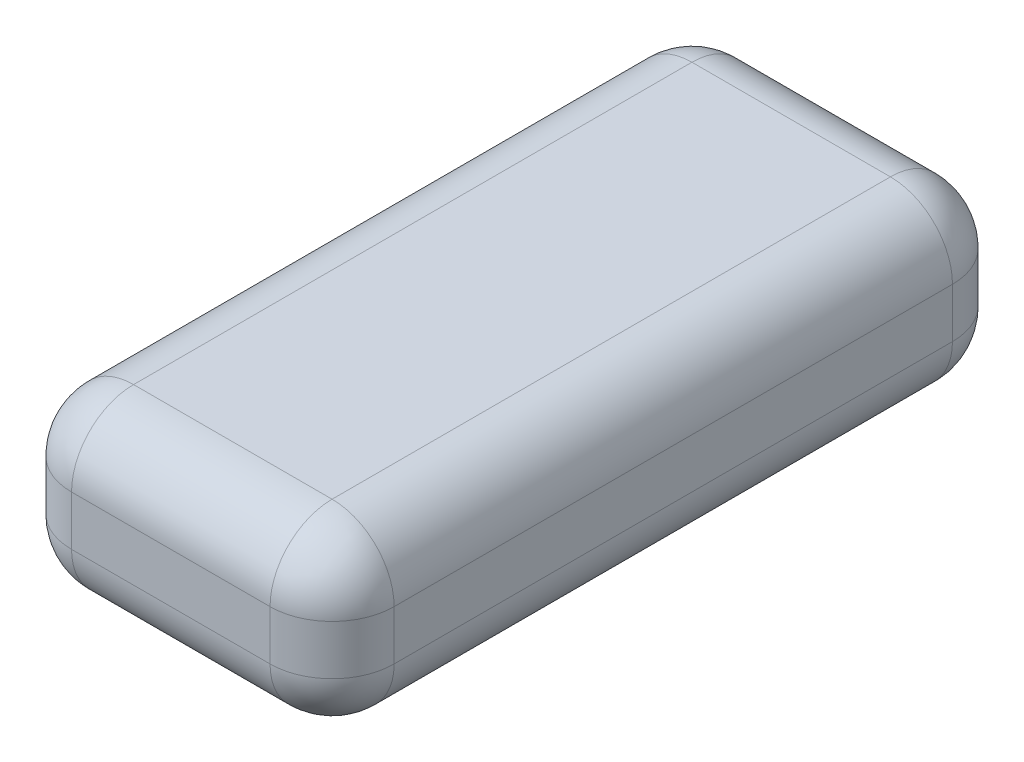
ISO-10303-21;
HEADER;
FILE_DESCRIPTION(('STEP AP214'),'2;1');
FILE_NAME('part.step','',(''),(''),'','','');
FILE_SCHEMA(('AUTOMOTIVE_DESIGN { 1 0 10303 214 1 1 1 1 }'));
ENDSEC;
DATA;
#1=APPLICATION_CONTEXT('core data for automotive mechanical design processes');
#2=APPLICATION_PROTOCOL_DEFINITION('international standard','automotive_design',2000,#1);
#3=PRODUCT_CONTEXT('',#1,'mechanical');
#4=PRODUCT('Part','Part','',(#3));
#5=PRODUCT_RELATED_PRODUCT_CATEGORY('part','',(#4));
#6=PRODUCT_DEFINITION_FORMATION('','',#4);
#7=PRODUCT_DEFINITION_CONTEXT('part definition',#1,'design');
#8=PRODUCT_DEFINITION('design','',#6,#7);
#9=PRODUCT_DEFINITION_SHAPE('','',#8);
#10=(LENGTH_UNIT() NAMED_UNIT(*) SI_UNIT(.MILLI.,.METRE.));
#11=(NAMED_UNIT(*) PLANE_ANGLE_UNIT() SI_UNIT($,.RADIAN.));
#12=(NAMED_UNIT(*) SI_UNIT($,.STERADIAN.) SOLID_ANGLE_UNIT());
#13=UNCERTAINTY_MEASURE_WITH_UNIT(LENGTH_MEASURE(1.E-05),#10,'distance_accuracy_value','');
#14=(GEOMETRIC_REPRESENTATION_CONTEXT(3) GLOBAL_UNCERTAINTY_ASSIGNED_CONTEXT((#13)) GLOBAL_UNIT_ASSIGNED_CONTEXT((#10,
#11,#12)) REPRESENTATION_CONTEXT('',''));
#15=CARTESIAN_POINT('',(0.,0.,0.));
#16=DIRECTION('',(0.,0.,1.));
#17=DIRECTION('',(1.,0.,0.));
#18=AXIS2_PLACEMENT_3D('',#15,#16,#17);
#19=CARTESIAN_POINT('',(-26.,-14.,110.));
#20=DIRECTION('',(1.,0.,0.));
#21=DIRECTION('',(0.,0.,-1.));
#22=AXIS2_PLACEMENT_3D('',#19,#20,#21);
#23=PLANE('',#22);
#24=DIRECTION('',(0.,-1.,0.));
#25=VECTOR('',#24,1.);
#26=CARTESIAN_POINT('',(-26.,14.,100.));
#27=LINE('',#26,#25);
#28=CARTESIAN_POINT('',(-26.,-4.,100.));
#29=VERTEX_POINT('',#28);
#30=CARTESIAN_POINT('',(-26.,4.,100.));
#31=VERTEX_POINT('',#30);
#32=EDGE_CURVE('E159',#29,#31,#27,.F.);
#33=ORIENTED_EDGE('',*,*,#32,.T.);
#34=DIRECTION('',(0.,0.,-1.));
#35=VECTOR('',#34,1.);
#36=CARTESIAN_POINT('',(-26.,4.,110.));
#37=LINE('',#36,#35);
#38=CARTESIAN_POINT('',(-26.,4.,9.99999999999999));
#39=VERTEX_POINT('',#38);
#40=EDGE_CURVE('E132',#31,#39,#37,.T.);
#41=ORIENTED_EDGE('',*,*,#40,.T.);
#42=DIRECTION('',(0.,-1.,0.));
#43=VECTOR('',#42,1.);
#44=CARTESIAN_POINT('',(-26.,-14.,9.99999999999999));
#45=LINE('',#44,#43);
#46=CARTESIAN_POINT('',(-26.,-4.,9.99999999999999));
#47=VERTEX_POINT('',#46);
#48=EDGE_CURVE('E150',#39,#47,#45,.T.);
#49=ORIENTED_EDGE('',*,*,#48,.T.);
#50=DIRECTION('',(0.,0.,-1.));
#51=VECTOR('',#50,1.);
#52=CARTESIAN_POINT('',(-26.,-4.,110.));
#53=LINE('',#52,#51);
#54=EDGE_CURVE('E156',#47,#29,#53,.F.);
#55=ORIENTED_EDGE('',*,*,#54,.T.);
#56=EDGE_LOOP('',(#33,#41,#49,#55));
#57=FACE_BOUND('',#56,.T.);
#58=ADVANCED_FACE('F39',(#57),#23,.F.);
#59=CARTESIAN_POINT('',(26.,-14.,110.));
#60=DIRECTION('',(0.,1.,0.));
#61=DIRECTION('',(-1.,0.,0.));
#62=AXIS2_PLACEMENT_3D('',#59,#60,#61);
#63=PLANE('',#62);
#64=DIRECTION('',(1.,0.,0.));
#65=VECTOR('',#64,1.);
#66=CARTESIAN_POINT('',(-26.,-14.,100.));
#67=LINE('',#66,#65);
#68=CARTESIAN_POINT('',(16.,-14.,100.));
#69=VERTEX_POINT('',#68);
#70=CARTESIAN_POINT('',(-16.,-14.,100.));
#71=VERTEX_POINT('',#70);
#72=EDGE_CURVE('E181',#69,#71,#67,.F.);
#73=ORIENTED_EDGE('',*,*,#72,.T.);
#74=DIRECTION('',(0.,0.,-1.));
#75=VECTOR('',#74,1.);
#76=CARTESIAN_POINT('',(-16.,-14.,110.));
#77=LINE('',#76,#75);
#78=CARTESIAN_POINT('',(-16.,-14.,9.99999999999999));
#79=VERTEX_POINT('',#78);
#80=EDGE_CURVE('E187',#71,#79,#77,.T.);
#81=ORIENTED_EDGE('',*,*,#80,.T.);
#82=DIRECTION('',(1.,0.,0.));
#83=VECTOR('',#82,1.);
#84=CARTESIAN_POINT('',(26.,-14.,9.99999999999999));
#85=LINE('',#84,#83);
#86=CARTESIAN_POINT('',(16.,-14.,9.99999999999999));
#87=VERTEX_POINT('',#86);
#88=EDGE_CURVE('E185',#79,#87,#85,.T.);
#89=ORIENTED_EDGE('',*,*,#88,.T.);
#90=DIRECTION('',(0.,0.,-1.));
#91=VECTOR('',#90,1.);
#92=CARTESIAN_POINT('',(16.,-14.,110.));
#93=LINE('',#92,#91);
#94=EDGE_CURVE('E183',#87,#69,#93,.F.);
#95=ORIENTED_EDGE('',*,*,#94,.T.);
#96=EDGE_LOOP('',(#73,#81,#89,#95));
#97=FACE_BOUND('',#96,.T.);
#98=ADVANCED_FACE('F282',(#97),#63,.F.);
#99=CARTESIAN_POINT('',(26.,-14.,110.));
#100=DIRECTION('',(-1.,0.,0.));
#101=DIRECTION('',(0.,0.,1.));
#102=AXIS2_PLACEMENT_3D('',#99,#100,#101);
#103=PLANE('',#102);
#104=DIRECTION('',(0.,0.,-1.));
#105=VECTOR('',#104,1.);
#106=CARTESIAN_POINT('',(26.,-4.,110.));
#107=LINE('',#106,#105);
#108=CARTESIAN_POINT('',(26.,-4.,100.));
#109=VERTEX_POINT('',#108);
#110=CARTESIAN_POINT('',(26.,-4.,9.99999999999999));
#111=VERTEX_POINT('',#110);
#112=EDGE_CURVE('E48',#109,#111,#107,.T.);
#113=ORIENTED_EDGE('',*,*,#112,.T.);
#114=DIRECTION('',(0.,1.,0.));
#115=VECTOR('',#114,1.);
#116=CARTESIAN_POINT('',(26.,-14.,9.99999999999999));
#117=LINE('',#116,#115);
#118=CARTESIAN_POINT('',(26.,4.,9.99999999999999));
#119=VERTEX_POINT('',#118);
#120=EDGE_CURVE('E11',#111,#119,#117,.T.);
#121=ORIENTED_EDGE('',*,*,#120,.T.);
#122=DIRECTION('',(0.,0.,-1.));
#123=VECTOR('',#122,1.);
#124=CARTESIAN_POINT('',(26.,4.00000000000001,110.));
#125=LINE('',#124,#123);
#126=CARTESIAN_POINT('',(26.,4.,100.));
#127=VERTEX_POINT('',#126);
#128=EDGE_CURVE('E199',#119,#127,#125,.F.);
#129=ORIENTED_EDGE('',*,*,#128,.T.);
#130=DIRECTION('',(0.,1.,0.));
#131=VECTOR('',#130,1.);
#132=CARTESIAN_POINT('',(26.,-14.,100.));
#133=LINE('',#132,#131);
#134=EDGE_CURVE('E59',#127,#109,#133,.F.);
#135=ORIENTED_EDGE('',*,*,#134,.T.);
#136=EDGE_LOOP('',(#113,#121,#129,#135));
#137=FACE_BOUND('',#136,.T.);
#138=ADVANCED_FACE('F301',(#137),#103,.F.);
#139=CARTESIAN_POINT('',(26.,14.,110.));
#140=DIRECTION('',(0.,-1.,0.));
#141=DIRECTION('',(1.,0.,0.));
#142=AXIS2_PLACEMENT_3D('',#139,#140,#141);
#143=PLANE('',#142);
#144=DIRECTION('',(-1.,0.,0.));
#145=VECTOR('',#144,1.);
#146=CARTESIAN_POINT('',(26.,14.,9.99999999999999));
#147=LINE('',#146,#145);
#148=CARTESIAN_POINT('',(16.,14.,9.99999999999999));
#149=VERTEX_POINT('',#148);
#150=CARTESIAN_POINT('',(-16.,14.,9.99999999999999));
#151=VERTEX_POINT('',#150);
#152=EDGE_CURVE('E169',#149,#151,#147,.T.);
#153=ORIENTED_EDGE('',*,*,#152,.T.);
#154=DIRECTION('',(0.,0.,-1.));
#155=VECTOR('',#154,1.);
#156=CARTESIAN_POINT('',(-16.,14.,110.));
#157=LINE('',#156,#155);
#158=CARTESIAN_POINT('',(-16.,14.,100.));
#159=VERTEX_POINT('',#158);
#160=EDGE_CURVE('E134',#151,#159,#157,.F.);
#161=ORIENTED_EDGE('',*,*,#160,.T.);
#162=DIRECTION('',(-1.,0.,0.));
#163=VECTOR('',#162,1.);
#164=CARTESIAN_POINT('',(26.,14.,100.));
#165=LINE('',#164,#163);
#166=CARTESIAN_POINT('',(16.,14.,100.));
#167=VERTEX_POINT('',#166);
#168=EDGE_CURVE('E161',#159,#167,#165,.F.);
#169=ORIENTED_EDGE('',*,*,#168,.T.);
#170=DIRECTION('',(0.,0.,-1.));
#171=VECTOR('',#170,1.);
#172=CARTESIAN_POINT('',(16.,14.,110.));
#173=LINE('',#172,#171);
#174=EDGE_CURVE('E163',#167,#149,#173,.T.);
#175=ORIENTED_EDGE('',*,*,#174,.T.);
#176=EDGE_LOOP('',(#153,#161,#169,#175));
#177=FACE_BOUND('',#176,.T.);
#178=ADVANCED_FACE('F360',(#177),#143,.F.);
#179=CARTESIAN_POINT('',(0.,0.,110.));
#180=DIRECTION('',(0.,0.,1.));
#181=DIRECTION('',(1.,0.,0.));
#182=AXIS2_PLACEMENT_3D('',#179,#180,#181);
#183=PLANE('',#182);
#184=DIRECTION('',(-1.,0.,0.));
#185=VECTOR('',#184,1.);
#186=CARTESIAN_POINT('',(-26.,4.,110.));
#187=LINE('',#186,#185);
#188=CARTESIAN_POINT('',(16.,4.,110.));
#189=VERTEX_POINT('',#188);
#190=CARTESIAN_POINT('',(-16.,4.,110.));
#191=VERTEX_POINT('',#190);
#192=EDGE_CURVE('E172',#189,#191,#187,.T.);
#193=ORIENTED_EDGE('',*,*,#192,.T.);
#194=DIRECTION('',(0.,-1.,0.));
#195=VECTOR('',#194,1.);
#196=CARTESIAN_POINT('',(-16.,-14.,110.));
#197=LINE('',#196,#195);
#198=CARTESIAN_POINT('',(-16.,-4.,110.));
#199=VERTEX_POINT('',#198);
#200=EDGE_CURVE('E178',#191,#199,#197,.T.);
#201=ORIENTED_EDGE('',*,*,#200,.T.);
#202=DIRECTION('',(1.,0.,0.));
#203=VECTOR('',#202,1.);
#204=CARTESIAN_POINT('',(26.,-4.,110.));
#205=LINE('',#204,#203);
#206=CARTESIAN_POINT('',(16.,-4.,110.));
#207=VERTEX_POINT('',#206);
#208=EDGE_CURVE('E176',#199,#207,#205,.T.);
#209=ORIENTED_EDGE('',*,*,#208,.T.);
#210=DIRECTION('',(0.,1.,0.));
#211=VECTOR('',#210,1.);
#212=CARTESIAN_POINT('',(16.,14.,110.));
#213=LINE('',#212,#211);
#214=EDGE_CURVE('E174',#207,#189,#213,.T.);
#215=ORIENTED_EDGE('',*,*,#214,.T.);
#216=EDGE_LOOP('',(#193,#201,#209,#215));
#217=FACE_BOUND('',#216,.T.);
#218=ADVANCED_FACE('F273',(#217),#183,.T.);
#219=CARTESIAN_POINT('',(0.,0.,0.));
#220=DIRECTION('',(0.,0.,1.));
#221=DIRECTION('',(1.,0.,0.));
#222=AXIS2_PLACEMENT_3D('',#219,#220,#221);
#223=PLANE('',#222);
#224=DIRECTION('',(1.,0.,0.));
#225=VECTOR('',#224,1.);
#226=CARTESIAN_POINT('',(0.,-4.,0.));
#227=LINE('',#226,#225);
#228=CARTESIAN_POINT('',(16.,-4.,0.));
#229=VERTEX_POINT('',#228);
#230=CARTESIAN_POINT('',(-16.,-4.,0.));
#231=VERTEX_POINT('',#230);
#232=EDGE_CURVE('E194',#229,#231,#227,.F.);
#233=ORIENTED_EDGE('',*,*,#232,.T.);
#234=DIRECTION('',(0.,-1.,0.));
#235=VECTOR('',#234,1.);
#236=CARTESIAN_POINT('',(-16.,0.,0.));
#237=LINE('',#236,#235);
#238=CARTESIAN_POINT('',(-16.,4.,0.));
#239=VERTEX_POINT('',#238);
#240=EDGE_CURVE('E196',#231,#239,#237,.F.);
#241=ORIENTED_EDGE('',*,*,#240,.T.);
#242=DIRECTION('',(-1.,0.,0.));
#243=VECTOR('',#242,1.);
#244=CARTESIAN_POINT('',(0.,4.,0.));
#245=LINE('',#244,#243);
#246=CARTESIAN_POINT('',(16.,4.,0.));
#247=VERTEX_POINT('',#246);
#248=EDGE_CURVE('E192',#239,#247,#245,.F.);
#249=ORIENTED_EDGE('',*,*,#248,.T.);
#250=DIRECTION('',(0.,1.,0.));
#251=VECTOR('',#250,1.);
#252=CARTESIAN_POINT('',(16.,0.,0.));
#253=LINE('',#252,#251);
#254=EDGE_CURVE('E190',#247,#229,#253,.F.);
#255=ORIENTED_EDGE('',*,*,#254,.T.);
#256=EDGE_LOOP('',(#233,#241,#249,#255));
#257=FACE_BOUND('',#256,.T.);
#258=ADVANCED_FACE('F367',(#257),#223,.F.);
#259=CARTESIAN_POINT('',(16.,-4.,110.));
#260=DIRECTION('',(0.,0.,-1.));
#261=DIRECTION('',(-1.,0.,0.));
#262=AXIS2_PLACEMENT_3D('',#259,#260,#261);
#263=CYLINDRICAL_SURFACE('',#262,10.);
#264=CARTESIAN_POINT('',(16.,-4.,100.));
#265=DIRECTION('',(0.,0.,1.));
#266=DIRECTION('',(1.,0.,0.));
#267=AXIS2_PLACEMENT_3D('',#264,#265,#266);
#268=CIRCLE('',#267,10.);
#269=EDGE_CURVE('E43',#69,#109,#268,.T.);
#270=ORIENTED_EDGE('',*,*,#269,.F.);
#271=ORIENTED_EDGE('',*,*,#94,.F.);
#272=CARTESIAN_POINT('',(16.,-4.,9.99999999999999));
#273=DIRECTION('',(0.,0.,-1.));
#274=DIRECTION('',(-1.,0.,0.));
#275=AXIS2_PLACEMENT_3D('',#272,#273,#274);
#276=CIRCLE('',#275,10.);
#277=EDGE_CURVE('E252',#111,#87,#276,.T.);
#278=ORIENTED_EDGE('',*,*,#277,.F.);
#279=ORIENTED_EDGE('',*,*,#112,.F.);
#280=EDGE_LOOP('',(#270,#271,#278,#279));
#281=FACE_BOUND('',#280,.T.);
#282=ADVANCED_FACE('F41',(#281),#263,.T.);
#283=CARTESIAN_POINT('',(16.,-4.,100.));
#284=DIRECTION('',(1.,0.,0.));
#285=DIRECTION('',(0.,0.,-1.));
#286=AXIS2_PLACEMENT_3D('',#283,#284,#285);
#287=SPHERICAL_SURFACE('',#286,10.);
#288=CARTESIAN_POINT('',(16.,-4.,100.));
#289=DIRECTION('',(1.,0.,0.));
#290=DIRECTION('',(0.,0.,-1.));
#291=AXIS2_PLACEMENT_3D('',#288,#289,#290);
#292=CIRCLE('',#291,10.);
#293=EDGE_CURVE('E247',#69,#207,#292,.F.);
#294=ORIENTED_EDGE('',*,*,#293,.F.);
#295=ORIENTED_EDGE('',*,*,#269,.T.);
#296=CARTESIAN_POINT('',(16.,-4.,100.));
#297=DIRECTION('',(0.,-1.,0.));
#298=DIRECTION('',(0.,0.,-1.));
#299=AXIS2_PLACEMENT_3D('',#296,#297,#298);
#300=CIRCLE('',#299,10.);
#301=EDGE_CURVE('E250',#207,#109,#300,.F.);
#302=ORIENTED_EDGE('',*,*,#301,.F.);
#303=EDGE_LOOP('',(#294,#295,#302));
#304=FACE_BOUND('',#303,.T.);
#305=ADVANCED_FACE('F262',(#304),#287,.T.);
#306=CARTESIAN_POINT('',(16.,-4.,10.));
#307=DIRECTION('',(0.,-1.,0.));
#308=DIRECTION('',(0.,0.,-1.));
#309=AXIS2_PLACEMENT_3D('',#306,#307,#308);
#310=SPHERICAL_SURFACE('',#309,10.);
#311=CARTESIAN_POINT('',(16.,-4.,10.));
#312=DIRECTION('',(0.,-1.,0.));
#313=DIRECTION('',(0.,0.,-1.));
#314=AXIS2_PLACEMENT_3D('',#311,#312,#313);
#315=CIRCLE('',#314,10.);
#316=EDGE_CURVE('E241',#111,#229,#315,.F.);
#317=ORIENTED_EDGE('',*,*,#316,.F.);
#318=ORIENTED_EDGE('',*,*,#277,.T.);
#319=CARTESIAN_POINT('',(16.,-4.,9.99999999999999));
#320=DIRECTION('',(1.,0.,0.));
#321=DIRECTION('',(0.,0.,-1.));
#322=AXIS2_PLACEMENT_3D('',#319,#320,#321);
#323=CIRCLE('',#322,10.);
#324=EDGE_CURVE('E244',#229,#87,#323,.F.);
#325=ORIENTED_EDGE('',*,*,#324,.F.);
#326=EDGE_LOOP('',(#317,#318,#325));
#327=FACE_BOUND('',#326,.T.);
#328=ADVANCED_FACE('F295',(#327),#310,.T.);
#329=CARTESIAN_POINT('',(16.,0.,100.));
#330=DIRECTION('',(0.,-1.,0.));
#331=DIRECTION('',(0.,0.,-1.));
#332=AXIS2_PLACEMENT_3D('',#329,#330,#331);
#333=CYLINDRICAL_SURFACE('',#332,10.);
#334=ORIENTED_EDGE('',*,*,#301,.T.);
#335=ORIENTED_EDGE('',*,*,#134,.F.);
#336=CARTESIAN_POINT('',(16.,4.,100.));
#337=DIRECTION('',(0.,1.,0.));
#338=DIRECTION('',(0.,0.,1.));
#339=AXIS2_PLACEMENT_3D('',#336,#337,#338);
#340=CIRCLE('',#339,10.);
#341=EDGE_CURVE('E235',#189,#127,#340,.T.);
#342=ORIENTED_EDGE('',*,*,#341,.F.);
#343=ORIENTED_EDGE('',*,*,#214,.F.);
#344=EDGE_LOOP('',(#334,#335,#342,#343));
#345=FACE_BOUND('',#344,.T.);
#346=ADVANCED_FACE('F268',(#345),#333,.T.);
#347=CARTESIAN_POINT('',(0.,-4.,100.));
#348=DIRECTION('',(-1.,0.,0.));
#349=DIRECTION('',(0.,-1.,0.));
#350=AXIS2_PLACEMENT_3D('',#347,#348,#349);
#351=CYLINDRICAL_SURFACE('',#350,10.);
#352=ORIENTED_EDGE('',*,*,#293,.T.);
#353=ORIENTED_EDGE('',*,*,#208,.F.);
#354=CARTESIAN_POINT('',(-16.,-4.,100.));
#355=DIRECTION('',(-1.,0.,0.));
#356=DIRECTION('',(0.,0.,1.));
#357=AXIS2_PLACEMENT_3D('',#354,#355,#356);
#358=CIRCLE('',#357,10.);
#359=EDGE_CURVE('E232',#71,#199,#358,.T.);
#360=ORIENTED_EDGE('',*,*,#359,.F.);
#361=ORIENTED_EDGE('',*,*,#72,.F.);
#362=EDGE_LOOP('',(#352,#353,#360,#361));
#363=FACE_BOUND('',#362,.T.);
#364=ADVANCED_FACE('F279',(#363),#351,.T.);
#365=CARTESIAN_POINT('',(-16.,-4.,110.));
#366=DIRECTION('',(0.,0.,-1.));
#367=DIRECTION('',(-1.,0.,0.));
#368=AXIS2_PLACEMENT_3D('',#365,#366,#367);
#369=CYLINDRICAL_SURFACE('',#368,10.);
#370=CARTESIAN_POINT('',(-16.,-4.,9.99999999999999));
#371=DIRECTION('',(0.,0.,-1.));
#372=DIRECTION('',(-1.,0.,0.));
#373=AXIS2_PLACEMENT_3D('',#370,#371,#372);
#374=CIRCLE('',#373,10.);
#375=EDGE_CURVE('E226',#79,#47,#374,.T.);
#376=ORIENTED_EDGE('',*,*,#375,.F.);
#377=ORIENTED_EDGE('',*,*,#80,.F.);
#378=CARTESIAN_POINT('',(-16.,-4.,100.));
#379=DIRECTION('',(0.,0.,1.));
#380=DIRECTION('',(1.,0.,0.));
#381=AXIS2_PLACEMENT_3D('',#378,#379,#380);
#382=CIRCLE('',#381,10.);
#383=EDGE_CURVE('E229',#29,#71,#382,.T.);
#384=ORIENTED_EDGE('',*,*,#383,.F.);
#385=ORIENTED_EDGE('',*,*,#54,.F.);
#386=EDGE_LOOP('',(#376,#377,#384,#385));
#387=FACE_BOUND('',#386,.T.);
#388=ADVANCED_FACE('F286',(#387),#369,.T.);
#389=CARTESIAN_POINT('',(26.,-4.,9.99999999999999));
#390=DIRECTION('',(1.,0.,0.));
#391=DIRECTION('',(0.,1.,0.));
#392=AXIS2_PLACEMENT_3D('',#389,#390,#391);
#393=CYLINDRICAL_SURFACE('',#392,10.);
#394=ORIENTED_EDGE('',*,*,#324,.T.);
#395=ORIENTED_EDGE('',*,*,#88,.F.);
#396=CARTESIAN_POINT('',(-16.,-4.,10.));
#397=DIRECTION('',(-1.,0.,0.));
#398=DIRECTION('',(0.,0.,1.));
#399=AXIS2_PLACEMENT_3D('',#396,#397,#398);
#400=CIRCLE('',#399,10.);
#401=EDGE_CURVE('E224',#231,#79,#400,.T.);
#402=ORIENTED_EDGE('',*,*,#401,.F.);
#403=ORIENTED_EDGE('',*,*,#232,.F.);
#404=EDGE_LOOP('',(#394,#395,#402,#403));
#405=FACE_BOUND('',#404,.T.);
#406=ADVANCED_FACE('F292',(#405),#393,.T.);
#407=CARTESIAN_POINT('',(16.,-14.,9.99999999999999));
#408=DIRECTION('',(0.,1.,0.));
#409=DIRECTION('',(0.,0.,1.));
#410=AXIS2_PLACEMENT_3D('',#407,#408,#409);
#411=CYLINDRICAL_SURFACE('',#410,10.);
#412=ORIENTED_EDGE('',*,*,#316,.T.);
#413=ORIENTED_EDGE('',*,*,#254,.F.);
#414=CARTESIAN_POINT('',(16.,4.,9.99999999999999));
#415=DIRECTION('',(0.,1.,0.));
#416=DIRECTION('',(0.,0.,1.));
#417=AXIS2_PLACEMENT_3D('',#414,#415,#416);
#418=CIRCLE('',#417,10.);
#419=EDGE_CURVE('E221',#119,#247,#418,.T.);
#420=ORIENTED_EDGE('',*,*,#419,.F.);
#421=ORIENTED_EDGE('',*,*,#120,.F.);
#422=EDGE_LOOP('',(#412,#413,#420,#421));
#423=FACE_BOUND('',#422,.T.);
#424=ADVANCED_FACE('F299',(#423),#411,.T.);
#425=CARTESIAN_POINT('',(16.,4.,110.));
#426=DIRECTION('',(0.,0.,-1.));
#427=DIRECTION('',(-1.,0.,0.));
#428=AXIS2_PLACEMENT_3D('',#425,#426,#427);
#429=CYLINDRICAL_SURFACE('',#428,10.);
#430=CARTESIAN_POINT('',(16.,4.,100.));
#431=DIRECTION('',(0.,0.,1.));
#432=DIRECTION('',(1.,0.,0.));
#433=AXIS2_PLACEMENT_3D('',#430,#431,#432);
#434=CIRCLE('',#433,10.);
#435=EDGE_CURVE('E238',#127,#167,#434,.T.);
#436=ORIENTED_EDGE('',*,*,#435,.F.);
#437=ORIENTED_EDGE('',*,*,#128,.F.);
#438=CARTESIAN_POINT('',(16.,4.,9.99999999999999));
#439=DIRECTION('',(0.,0.,-1.));
#440=DIRECTION('',(-1.,0.,0.));
#441=AXIS2_PLACEMENT_3D('',#438,#439,#440);
#442=CIRCLE('',#441,10.);
#443=EDGE_CURVE('E219',#149,#119,#442,.T.);
#444=ORIENTED_EDGE('',*,*,#443,.F.);
#445=ORIENTED_EDGE('',*,*,#174,.F.);
#446=EDGE_LOOP('',(#436,#437,#444,#445));
#447=FACE_BOUND('',#446,.T.);
#448=ADVANCED_FACE('F304',(#447),#429,.T.);
#449=CARTESIAN_POINT('',(16.,4.,100.));
#450=DIRECTION('',(1.,0.,0.));
#451=DIRECTION('',(0.,0.,-1.));
#452=AXIS2_PLACEMENT_3D('',#449,#450,#451);
#453=SPHERICAL_SURFACE('',#452,10.);
#454=ORIENTED_EDGE('',*,*,#341,.T.);
#455=ORIENTED_EDGE('',*,*,#435,.T.);
#456=CARTESIAN_POINT('',(16.,4.,100.));
#457=DIRECTION('',(1.,0.,0.));
#458=DIRECTION('',(0.,0.,-1.));
#459=AXIS2_PLACEMENT_3D('',#456,#457,#458);
#460=CIRCLE('',#459,10.);
#461=EDGE_CURVE('E216',#189,#167,#460,.F.);
#462=ORIENTED_EDGE('',*,*,#461,.F.);
#463=EDGE_LOOP('',(#454,#455,#462));
#464=FACE_BOUND('',#463,.T.);
#465=ADVANCED_FACE('F308',(#464),#453,.T.);
#466=CARTESIAN_POINT('',(-16.,-4.,100.));
#467=DIRECTION('',(0.,-1.,0.));
#468=DIRECTION('',(0.,0.,-1.));
#469=AXIS2_PLACEMENT_3D('',#466,#467,#468);
#470=SPHERICAL_SURFACE('',#469,10.);
#471=ORIENTED_EDGE('',*,*,#383,.T.);
#472=ORIENTED_EDGE('',*,*,#359,.T.);
#473=CARTESIAN_POINT('',(-16.,-4.,100.));
#474=DIRECTION('',(0.,-1.,0.));
#475=DIRECTION('',(0.,0.,-1.));
#476=AXIS2_PLACEMENT_3D('',#473,#474,#475);
#477=CIRCLE('',#476,10.);
#478=EDGE_CURVE('E214',#29,#199,#477,.F.);
#479=ORIENTED_EDGE('',*,*,#478,.F.);
#480=EDGE_LOOP('',(#471,#472,#479));
#481=FACE_BOUND('',#480,.T.);
#482=ADVANCED_FACE('F319',(#481),#470,.T.);
#483=CARTESIAN_POINT('',(-16.,-4.,10.));
#484=DIRECTION('',(0.,-1.,0.));
#485=DIRECTION('',(0.,0.,-1.));
#486=AXIS2_PLACEMENT_3D('',#483,#484,#485);
#487=SPHERICAL_SURFACE('',#486,10.);
#488=ORIENTED_EDGE('',*,*,#401,.T.);
#489=ORIENTED_EDGE('',*,*,#375,.T.);
#490=CARTESIAN_POINT('',(-16.,-4.,9.99999999999999));
#491=DIRECTION('',(0.,-1.,0.));
#492=DIRECTION('',(0.,0.,-1.));
#493=AXIS2_PLACEMENT_3D('',#490,#491,#492);
#494=CIRCLE('',#493,10.);
#495=EDGE_CURVE('E153',#231,#47,#494,.F.);
#496=ORIENTED_EDGE('',*,*,#495,.F.);
#497=EDGE_LOOP('',(#488,#489,#496));
#498=FACE_BOUND('',#497,.T.);
#499=ADVANCED_FACE('F321',(#498),#487,.T.);
#500=CARTESIAN_POINT('',(16.,4.,10.));
#501=DIRECTION('',(1.,0.,0.));
#502=DIRECTION('',(0.,0.,-1.));
#503=AXIS2_PLACEMENT_3D('',#500,#501,#502);
#504=SPHERICAL_SURFACE('',#503,10.);
#505=ORIENTED_EDGE('',*,*,#443,.T.);
#506=ORIENTED_EDGE('',*,*,#419,.T.);
#507=CARTESIAN_POINT('',(16.,4.,10.));
#508=DIRECTION('',(1.,0.,0.));
#509=DIRECTION('',(0.,0.,-1.));
#510=AXIS2_PLACEMENT_3D('',#507,#508,#509);
#511=CIRCLE('',#510,10.);
#512=EDGE_CURVE('E210',#149,#247,#511,.F.);
#513=ORIENTED_EDGE('',*,*,#512,.F.);
#514=EDGE_LOOP('',(#505,#506,#513));
#515=FACE_BOUND('',#514,.T.);
#516=ADVANCED_FACE('F327',(#515),#504,.T.);
#517=CARTESIAN_POINT('',(0.,4.,100.));
#518=DIRECTION('',(1.,0.,0.));
#519=DIRECTION('',(0.,1.,0.));
#520=AXIS2_PLACEMENT_3D('',#517,#518,#519);
#521=CYLINDRICAL_SURFACE('',#520,10.);
#522=ORIENTED_EDGE('',*,*,#461,.T.);
#523=ORIENTED_EDGE('',*,*,#168,.F.);
#524=CARTESIAN_POINT('',(-16.,4.,100.));
#525=DIRECTION('',(-1.,0.,0.));
#526=DIRECTION('',(0.,0.,1.));
#527=AXIS2_PLACEMENT_3D('',#524,#525,#526);
#528=CIRCLE('',#527,10.);
#529=EDGE_CURVE('E207',#191,#159,#528,.T.);
#530=ORIENTED_EDGE('',*,*,#529,.F.);
#531=ORIENTED_EDGE('',*,*,#192,.F.);
#532=EDGE_LOOP('',(#522,#523,#530,#531));
#533=FACE_BOUND('',#532,.T.);
#534=ADVANCED_FACE('F312',(#533),#521,.T.);
#535=CARTESIAN_POINT('',(-16.,0.,100.));
#536=DIRECTION('',(0.,1.,0.));
#537=DIRECTION('',(0.,0.,1.));
#538=AXIS2_PLACEMENT_3D('',#535,#536,#537);
#539=CYLINDRICAL_SURFACE('',#538,10.);
#540=ORIENTED_EDGE('',*,*,#478,.T.);
#541=ORIENTED_EDGE('',*,*,#200,.F.);
#542=CARTESIAN_POINT('',(-16.,4.,100.));
#543=DIRECTION('',(0.,1.,0.));
#544=DIRECTION('',(0.,0.,1.));
#545=AXIS2_PLACEMENT_3D('',#542,#543,#544);
#546=CIRCLE('',#545,10.);
#547=EDGE_CURVE('E147',#31,#191,#546,.T.);
#548=ORIENTED_EDGE('',*,*,#547,.F.);
#549=ORIENTED_EDGE('',*,*,#32,.F.);
#550=EDGE_LOOP('',(#540,#541,#548,#549));
#551=FACE_BOUND('',#550,.T.);
#552=ADVANCED_FACE('F317',(#551),#539,.T.);
#553=CARTESIAN_POINT('',(-16.,-14.,9.99999999999999));
#554=DIRECTION('',(0.,-1.,0.));
#555=DIRECTION('',(0.,0.,-1.));
#556=AXIS2_PLACEMENT_3D('',#553,#554,#555);
#557=CYLINDRICAL_SURFACE('',#556,10.);
#558=ORIENTED_EDGE('',*,*,#495,.T.);
#559=ORIENTED_EDGE('',*,*,#48,.F.);
#560=CARTESIAN_POINT('',(-16.,4.,10.));
#561=DIRECTION('',(0.,1.,0.));
#562=DIRECTION('',(-1.,0.,0.));
#563=AXIS2_PLACEMENT_3D('',#560,#561,#562);
#564=CIRCLE('',#563,10.);
#565=EDGE_CURVE('E139',#239,#39,#564,.T.);
#566=ORIENTED_EDGE('',*,*,#565,.F.);
#567=ORIENTED_EDGE('',*,*,#240,.F.);
#568=EDGE_LOOP('',(#558,#559,#566,#567));
#569=FACE_BOUND('',#568,.T.);
#570=ADVANCED_FACE('F151',(#569),#557,.T.);
#571=CARTESIAN_POINT('',(26.,4.00000000000001,9.99999999999999));
#572=DIRECTION('',(-1.,0.,0.));
#573=DIRECTION('',(0.,-1.,0.));
#574=AXIS2_PLACEMENT_3D('',#571,#572,#573);
#575=CYLINDRICAL_SURFACE('',#574,10.);
#576=ORIENTED_EDGE('',*,*,#512,.T.);
#577=ORIENTED_EDGE('',*,*,#248,.F.);
#578=CARTESIAN_POINT('',(-16.,4.,9.99999999999999));
#579=DIRECTION('',(-1.,0.,0.));
#580=DIRECTION('',(0.,0.,1.));
#581=AXIS2_PLACEMENT_3D('',#578,#579,#580);
#582=CIRCLE('',#581,10.);
#583=EDGE_CURVE('E143',#151,#239,#582,.T.);
#584=ORIENTED_EDGE('',*,*,#583,.F.);
#585=ORIENTED_EDGE('',*,*,#152,.F.);
#586=EDGE_LOOP('',(#576,#577,#584,#585));
#587=FACE_BOUND('',#586,.T.);
#588=ADVANCED_FACE('F344',(#587),#575,.T.);
#589=CARTESIAN_POINT('',(-16.,4.,100.));
#590=DIRECTION('',(0.,0.,1.));
#591=DIRECTION('',(1.,0.,0.));
#592=AXIS2_PLACEMENT_3D('',#589,#590,#591);
#593=SPHERICAL_SURFACE('',#592,10.);
#594=ORIENTED_EDGE('',*,*,#547,.T.);
#595=ORIENTED_EDGE('',*,*,#529,.T.);
#596=CARTESIAN_POINT('',(-16.,4.,100.));
#597=DIRECTION('',(0.,0.,1.));
#598=DIRECTION('',(1.,0.,0.));
#599=AXIS2_PLACEMENT_3D('',#596,#597,#598);
#600=CIRCLE('',#599,10.);
#601=EDGE_CURVE('E136',#31,#159,#600,.F.);
#602=ORIENTED_EDGE('',*,*,#601,.F.);
#603=EDGE_LOOP('',(#594,#595,#602));
#604=FACE_BOUND('',#603,.T.);
#605=ADVANCED_FACE('F315',(#604),#593,.T.);
#606=CARTESIAN_POINT('',(-16.,4.,10.));
#607=DIRECTION('',(0.,0.,-1.));
#608=DIRECTION('',(-1.,0.,0.));
#609=AXIS2_PLACEMENT_3D('',#606,#607,#608);
#610=SPHERICAL_SURFACE('',#609,10.);
#611=ORIENTED_EDGE('',*,*,#583,.T.);
#612=ORIENTED_EDGE('',*,*,#565,.T.);
#613=CARTESIAN_POINT('',(-16.,4.,9.99999999999999));
#614=DIRECTION('',(0.,0.,-1.));
#615=DIRECTION('',(-1.,0.,0.));
#616=AXIS2_PLACEMENT_3D('',#613,#614,#615);
#617=CIRCLE('',#616,10.);
#618=EDGE_CURVE('E128',#151,#39,#617,.F.);
#619=ORIENTED_EDGE('',*,*,#618,.F.);
#620=EDGE_LOOP('',(#611,#612,#619));
#621=FACE_BOUND('',#620,.T.);
#622=ADVANCED_FACE('F141',(#621),#610,.T.);
#623=CARTESIAN_POINT('',(-16.,4.,110.));
#624=DIRECTION('',(0.,0.,-1.));
#625=DIRECTION('',(-1.,0.,0.));
#626=AXIS2_PLACEMENT_3D('',#623,#624,#625);
#627=CYLINDRICAL_SURFACE('',#626,10.);
#628=ORIENTED_EDGE('',*,*,#601,.T.);
#629=ORIENTED_EDGE('',*,*,#160,.F.);
#630=ORIENTED_EDGE('',*,*,#618,.T.);
#631=ORIENTED_EDGE('',*,*,#40,.F.);
#632=EDGE_LOOP('',(#628,#629,#630,#631));
#633=FACE_BOUND('',#632,.T.);
#634=ADVANCED_FACE('F130',(#633),#627,.T.);
#635=CLOSED_SHELL('',(#58,#98,#138,#178,#218,#258,#282,#305,#328,#346,#364,#388,#406,#424,#448,
#465,#482,#499,#516,#534,#552,#570,#588,#605,#622,#634));
#636=MANIFOLD_SOLID_BREP('B2',#635);
#637=ADVANCED_BREP_SHAPE_REPRESENTATION('',(#18,#636),#14);
#638=SHAPE_DEFINITION_REPRESENTATION(#9,#637);
ENDSEC;
END-ISO-10303-21;
